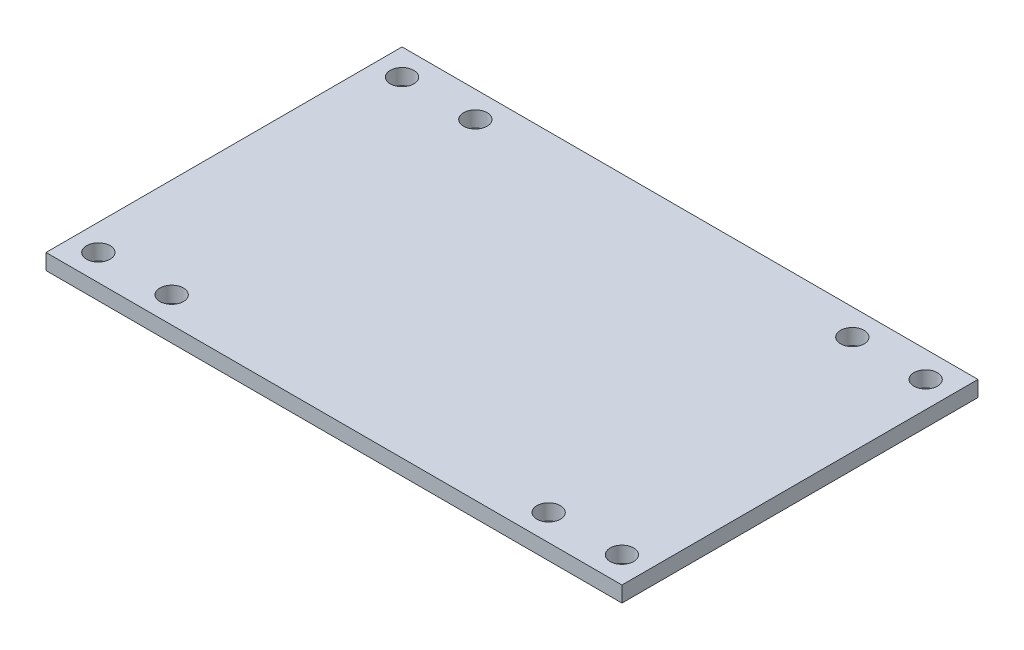
ISO-10303-21;
HEADER;
FILE_DESCRIPTION(('STEP AP214'),'2;1');
FILE_NAME('part.step','',(''),(''),'','','');
FILE_SCHEMA(('AUTOMOTIVE_DESIGN { 1 0 10303 214 1 1 1 1 }'));
ENDSEC;
DATA;
#1=APPLICATION_CONTEXT('core data for automotive mechanical design processes');
#2=APPLICATION_PROTOCOL_DEFINITION('international standard','automotive_design',2000,#1);
#3=PRODUCT_CONTEXT('',#1,'mechanical');
#4=PRODUCT('Part','Part','',(#3));
#5=PRODUCT_RELATED_PRODUCT_CATEGORY('part','',(#4));
#6=PRODUCT_DEFINITION_FORMATION('','',#4);
#7=PRODUCT_DEFINITION_CONTEXT('part definition',#1,'design');
#8=PRODUCT_DEFINITION('design','',#6,#7);
#9=PRODUCT_DEFINITION_SHAPE('','',#8);
#10=(LENGTH_UNIT() NAMED_UNIT(*) SI_UNIT(.MILLI.,.METRE.));
#11=(NAMED_UNIT(*) PLANE_ANGLE_UNIT() SI_UNIT($,.RADIAN.));
#12=(NAMED_UNIT(*) SI_UNIT($,.STERADIAN.) SOLID_ANGLE_UNIT());
#13=UNCERTAINTY_MEASURE_WITH_UNIT(LENGTH_MEASURE(1.E-05),#10,'distance_accuracy_value','');
#14=(GEOMETRIC_REPRESENTATION_CONTEXT(3) GLOBAL_UNCERTAINTY_ASSIGNED_CONTEXT((#13)) GLOBAL_UNIT_ASSIGNED_CONTEXT((#10,
#11,#12)) REPRESENTATION_CONTEXT('',''));
#15=CARTESIAN_POINT('',(0.,0.,0.));
#16=DIRECTION('',(0.,0.,1.));
#17=DIRECTION('',(1.,0.,0.));
#18=AXIS2_PLACEMENT_3D('',#15,#16,#17);
#19=CARTESIAN_POINT('',(-27.5,1.5,0.));
#20=DIRECTION('',(-1.,0.,0.));
#21=DIRECTION('',(0.,0.,1.));
#22=AXIS2_PLACEMENT_3D('',#19,#20,#21);
#23=PLANE('',#22);
#24=DIRECTION('',(0.,0.,-1.));
#25=VECTOR('',#24,1.);
#26=CARTESIAN_POINT('',(-27.5,0.,0.));
#27=LINE('',#26,#25);
#28=CARTESIAN_POINT('',(-27.5,0.,17.));
#29=VERTEX_POINT('',#28);
#30=CARTESIAN_POINT('',(-27.5,0.,-17.));
#31=VERTEX_POINT('',#30);
#32=EDGE_CURVE('E118',#29,#31,#27,.T.);
#33=ORIENTED_EDGE('',*,*,#32,.F.);
#34=DIRECTION('',(0.,-1.,0.));
#35=VECTOR('',#34,1.);
#36=CARTESIAN_POINT('',(-27.5,1.5,17.));
#37=LINE('',#36,#35);
#38=CARTESIAN_POINT('',(-27.5,1.5,17.));
#39=VERTEX_POINT('',#38);
#40=EDGE_CURVE('E11',#39,#29,#37,.T.);
#41=ORIENTED_EDGE('',*,*,#40,.F.);
#42=DIRECTION('',(0.,0.,-1.));
#43=VECTOR('',#42,1.);
#44=CARTESIAN_POINT('',(-27.5,1.5,0.));
#45=LINE('',#44,#43);
#46=CARTESIAN_POINT('',(-27.5,1.5,-17.));
#47=VERTEX_POINT('',#46);
#48=EDGE_CURVE('E107',#39,#47,#45,.T.);
#49=ORIENTED_EDGE('',*,*,#48,.T.);
#50=DIRECTION('',(0.,-1.,0.));
#51=VECTOR('',#50,1.);
#52=CARTESIAN_POINT('',(-27.5,1.5,-17.));
#53=LINE('',#52,#51);
#54=EDGE_CURVE('E86',#47,#31,#53,.T.);
#55=ORIENTED_EDGE('',*,*,#54,.T.);
#56=EDGE_LOOP('',(#33,#41,#49,#55));
#57=FACE_BOUND('',#56,.T.);
#58=ADVANCED_FACE('F47',(#57),#23,.T.);
#59=CARTESIAN_POINT('',(0.,1.5,17.));
#60=DIRECTION('',(0.,0.,1.));
#61=DIRECTION('',(1.,0.,0.));
#62=AXIS2_PLACEMENT_3D('',#59,#60,#61);
#63=PLANE('',#62);
#64=DIRECTION('',(-1.,0.,0.));
#65=VECTOR('',#64,1.);
#66=CARTESIAN_POINT('',(0.,0.,17.));
#67=LINE('',#66,#65);
#68=CARTESIAN_POINT('',(27.5,0.,17.));
#69=VERTEX_POINT('',#68);
#70=EDGE_CURVE('E99',#69,#29,#67,.T.);
#71=ORIENTED_EDGE('',*,*,#70,.F.);
#72=DIRECTION('',(0.,-1.,0.));
#73=VECTOR('',#72,1.);
#74=CARTESIAN_POINT('',(27.5,1.5,17.));
#75=LINE('',#74,#73);
#76=CARTESIAN_POINT('',(27.5,1.5,17.));
#77=VERTEX_POINT('',#76);
#78=EDGE_CURVE('E56',#77,#69,#75,.T.);
#79=ORIENTED_EDGE('',*,*,#78,.F.);
#80=DIRECTION('',(-1.,0.,0.));
#81=VECTOR('',#80,1.);
#82=CARTESIAN_POINT('',(0.,1.5,17.));
#83=LINE('',#82,#81);
#84=EDGE_CURVE('E97',#77,#39,#83,.T.);
#85=ORIENTED_EDGE('',*,*,#84,.T.);
#86=ORIENTED_EDGE('',*,*,#40,.T.);
#87=EDGE_LOOP('',(#71,#79,#85,#86));
#88=FACE_BOUND('',#87,.T.);
#89=ADVANCED_FACE('F95',(#88),#63,.T.);
#90=CARTESIAN_POINT('',(27.5,1.5,0.));
#91=DIRECTION('',(-1.,0.,0.));
#92=DIRECTION('',(0.,0.,1.));
#93=AXIS2_PLACEMENT_3D('',#90,#91,#92);
#94=PLANE('',#93);
#95=DIRECTION('',(0.,0.,-1.));
#96=VECTOR('',#95,1.);
#97=CARTESIAN_POINT('',(27.5,0.,0.));
#98=LINE('',#97,#96);
#99=CARTESIAN_POINT('',(27.5,0.,-17.));
#100=VERTEX_POINT('',#99);
#101=EDGE_CURVE('E79',#69,#100,#98,.T.);
#102=ORIENTED_EDGE('',*,*,#101,.T.);
#103=DIRECTION('',(0.,-1.,0.));
#104=VECTOR('',#103,1.);
#105=CARTESIAN_POINT('',(27.5,1.5,-17.));
#106=LINE('',#105,#104);
#107=CARTESIAN_POINT('',(27.5,1.5,-17.));
#108=VERTEX_POINT('',#107);
#109=EDGE_CURVE('E101',#108,#100,#106,.T.);
#110=ORIENTED_EDGE('',*,*,#109,.F.);
#111=DIRECTION('',(0.,0.,-1.));
#112=VECTOR('',#111,1.);
#113=CARTESIAN_POINT('',(27.5,1.5,0.));
#114=LINE('',#113,#112);
#115=EDGE_CURVE('E102',#77,#108,#114,.T.);
#116=ORIENTED_EDGE('',*,*,#115,.F.);
#117=ORIENTED_EDGE('',*,*,#78,.T.);
#118=EDGE_LOOP('',(#102,#110,#116,#117));
#119=FACE_BOUND('',#118,.T.);
#120=ADVANCED_FACE('F103',(#119),#94,.F.);
#121=CARTESIAN_POINT('',(0.,1.5,-17.));
#122=DIRECTION('',(0.,0.,1.));
#123=DIRECTION('',(1.,0.,0.));
#124=AXIS2_PLACEMENT_3D('',#121,#122,#123);
#125=PLANE('',#124);
#126=DIRECTION('',(-1.,0.,0.));
#127=VECTOR('',#126,1.);
#128=CARTESIAN_POINT('',(0.,0.,-17.));
#129=LINE('',#128,#127);
#130=EDGE_CURVE('E112',#100,#31,#129,.T.);
#131=ORIENTED_EDGE('',*,*,#130,.T.);
#132=ORIENTED_EDGE('',*,*,#54,.F.);
#133=DIRECTION('',(-1.,0.,0.));
#134=VECTOR('',#133,1.);
#135=CARTESIAN_POINT('',(0.,1.5,-17.));
#136=LINE('',#135,#134);
#137=EDGE_CURVE('E64',#108,#47,#136,.T.);
#138=ORIENTED_EDGE('',*,*,#137,.F.);
#139=ORIENTED_EDGE('',*,*,#109,.T.);
#140=EDGE_LOOP('',(#131,#132,#138,#139));
#141=FACE_BOUND('',#140,.T.);
#142=ADVANCED_FACE('F135',(#141),#125,.F.);
#143=CARTESIAN_POINT('',(0.,1.5,0.));
#144=DIRECTION('',(0.,1.,0.));
#145=DIRECTION('',(0.,0.,1.));
#146=AXIS2_PLACEMENT_3D('',#143,#144,#145);
#147=PLANE('',#146);
#148=CARTESIAN_POINT('',(-18.,1.5,14.5));
#149=DIRECTION('',(0.,1.,0.));
#150=DIRECTION('',(0.,0.,1.));
#151=AXIS2_PLACEMENT_3D('',#148,#149,#150);
#152=CIRCLE('',#151,1.125);
#153=CARTESIAN_POINT('',(-18.,1.5,15.625));
#154=VERTEX_POINT('',#153);
#155=EDGE_CURVE('E228',#154,#154,#152,.T.);
#156=ORIENTED_EDGE('',*,*,#155,.F.);
#157=EDGE_LOOP('',(#156));
#158=FACE_BOUND('',#157,.T.);
#159=CARTESIAN_POINT('',(18.,1.5,-14.5));
#160=DIRECTION('',(0.,1.,0.));
#161=DIRECTION('',(0.,0.,1.));
#162=AXIS2_PLACEMENT_3D('',#159,#160,#161);
#163=CIRCLE('',#162,1.125);
#164=CARTESIAN_POINT('',(18.,1.5,-13.375));
#165=VERTEX_POINT('',#164);
#166=EDGE_CURVE('E219',#165,#165,#163,.T.);
#167=ORIENTED_EDGE('',*,*,#166,.F.);
#168=EDGE_LOOP('',(#167));
#169=FACE_BOUND('',#168,.T.);
#170=CARTESIAN_POINT('',(-18.,1.5,-14.5));
#171=DIRECTION('',(0.,1.,0.));
#172=DIRECTION('',(0.,0.,1.));
#173=AXIS2_PLACEMENT_3D('',#170,#171,#172);
#174=CIRCLE('',#173,1.125);
#175=CARTESIAN_POINT('',(-18.,1.5,-13.375));
#176=VERTEX_POINT('',#175);
#177=EDGE_CURVE('E244',#176,#176,#174,.T.);
#178=ORIENTED_EDGE('',*,*,#177,.F.);
#179=EDGE_LOOP('',(#178));
#180=FACE_BOUND('',#179,.T.);
#181=CARTESIAN_POINT('',(25.,1.5,-14.5));
#182=DIRECTION('',(0.,1.,0.));
#183=DIRECTION('',(0.,0.,1.));
#184=AXIS2_PLACEMENT_3D('',#181,#182,#183);
#185=CIRCLE('',#184,1.125);
#186=CARTESIAN_POINT('',(25.,1.5,-13.375));
#187=VERTEX_POINT('',#186);
#188=EDGE_CURVE('E235',#187,#187,#185,.T.);
#189=ORIENTED_EDGE('',*,*,#188,.F.);
#190=EDGE_LOOP('',(#189));
#191=FACE_BOUND('',#190,.T.);
#192=CARTESIAN_POINT('',(18.,1.5,14.5));
#193=DIRECTION('',(0.,1.,0.));
#194=DIRECTION('',(0.,0.,1.));
#195=AXIS2_PLACEMENT_3D('',#192,#193,#194);
#196=CIRCLE('',#195,1.125);
#197=CARTESIAN_POINT('',(18.,1.5,15.625));
#198=VERTEX_POINT('',#197);
#199=EDGE_CURVE('E191',#198,#198,#196,.T.);
#200=ORIENTED_EDGE('',*,*,#199,.F.);
#201=EDGE_LOOP('',(#200));
#202=FACE_BOUND('',#201,.T.);
#203=CARTESIAN_POINT('',(25.,1.5,14.5));
#204=DIRECTION('',(0.,1.,0.));
#205=DIRECTION('',(0.,0.,1.));
#206=AXIS2_PLACEMENT_3D('',#203,#204,#205);
#207=CIRCLE('',#206,1.125);
#208=CARTESIAN_POINT('',(25.,1.5,15.625));
#209=VERTEX_POINT('',#208);
#210=EDGE_CURVE('E197',#209,#209,#207,.T.);
#211=ORIENTED_EDGE('',*,*,#210,.F.);
#212=EDGE_LOOP('',(#211));
#213=FACE_BOUND('',#212,.T.);
#214=CARTESIAN_POINT('',(-25.,1.5,14.5));
#215=DIRECTION('',(0.,1.,0.));
#216=DIRECTION('',(0.,0.,1.));
#217=AXIS2_PLACEMENT_3D('',#214,#215,#216);
#218=CIRCLE('',#217,1.125);
#219=CARTESIAN_POINT('',(-25.,1.5,15.625));
#220=VERTEX_POINT('',#219);
#221=EDGE_CURVE('E211',#220,#220,#218,.T.);
#222=ORIENTED_EDGE('',*,*,#221,.F.);
#223=EDGE_LOOP('',(#222));
#224=FACE_BOUND('',#223,.T.);
#225=CARTESIAN_POINT('',(-25.,1.5,-14.5));
#226=DIRECTION('',(0.,1.,0.));
#227=DIRECTION('',(0.,0.,1.));
#228=AXIS2_PLACEMENT_3D('',#225,#226,#227);
#229=CIRCLE('',#228,1.125);
#230=CARTESIAN_POINT('',(-25.,1.5,-13.375));
#231=VERTEX_POINT('',#230);
#232=EDGE_CURVE('E122',#231,#231,#229,.T.);
#233=ORIENTED_EDGE('',*,*,#232,.F.);
#234=EDGE_LOOP('',(#233));
#235=FACE_BOUND('',#234,.T.);
#236=ORIENTED_EDGE('',*,*,#48,.F.);
#237=ORIENTED_EDGE('',*,*,#84,.F.);
#238=ORIENTED_EDGE('',*,*,#115,.T.);
#239=ORIENTED_EDGE('',*,*,#137,.T.);
#240=EDGE_LOOP('',(#236,#237,#238,#239));
#241=FACE_BOUND('',#240,.T.);
#242=ADVANCED_FACE('F106',(#158,#169,#180,#191,#202,#213,#224,#235,#241),#147,.T.);
#243=CARTESIAN_POINT('',(0.,0.,0.));
#244=DIRECTION('',(0.,1.,0.));
#245=DIRECTION('',(0.,0.,1.));
#246=AXIS2_PLACEMENT_3D('',#243,#244,#245);
#247=PLANE('',#246);
#248=CARTESIAN_POINT('',(-18.,0.,14.5));
#249=DIRECTION('',(0.,1.,0.));
#250=DIRECTION('',(0.,0.,1.));
#251=AXIS2_PLACEMENT_3D('',#248,#249,#250);
#252=CIRCLE('',#251,1.125);
#253=CARTESIAN_POINT('',(-18.,0.,15.625));
#254=VERTEX_POINT('',#253);
#255=EDGE_CURVE('E202',#254,#254,#252,.T.);
#256=ORIENTED_EDGE('',*,*,#255,.T.);
#257=EDGE_LOOP('',(#256));
#258=FACE_BOUND('',#257,.T.);
#259=CARTESIAN_POINT('',(18.,0.,-14.5));
#260=DIRECTION('',(0.,1.,0.));
#261=DIRECTION('',(0.,0.,1.));
#262=AXIS2_PLACEMENT_3D('',#259,#260,#261);
#263=CIRCLE('',#262,1.125);
#264=CARTESIAN_POINT('',(18.,0.,-13.375));
#265=VERTEX_POINT('',#264);
#266=EDGE_CURVE('E224',#265,#265,#263,.T.);
#267=ORIENTED_EDGE('',*,*,#266,.T.);
#268=EDGE_LOOP('',(#267));
#269=FACE_BOUND('',#268,.T.);
#270=CARTESIAN_POINT('',(-18.,0.,-14.5));
#271=DIRECTION('',(0.,1.,0.));
#272=DIRECTION('',(0.,0.,1.));
#273=AXIS2_PLACEMENT_3D('',#270,#271,#272);
#274=CIRCLE('',#273,1.125);
#275=CARTESIAN_POINT('',(-18.,0.,-13.375));
#276=VERTEX_POINT('',#275);
#277=EDGE_CURVE('E223',#276,#276,#274,.T.);
#278=ORIENTED_EDGE('',*,*,#277,.T.);
#279=EDGE_LOOP('',(#278));
#280=FACE_BOUND('',#279,.T.);
#281=CARTESIAN_POINT('',(25.,0.,-14.5));
#282=DIRECTION('',(0.,1.,0.));
#283=DIRECTION('',(0.,0.,1.));
#284=AXIS2_PLACEMENT_3D('',#281,#282,#283);
#285=CIRCLE('',#284,1.125);
#286=CARTESIAN_POINT('',(25.,0.,-13.375));
#287=VERTEX_POINT('',#286);
#288=EDGE_CURVE('E240',#287,#287,#285,.T.);
#289=ORIENTED_EDGE('',*,*,#288,.T.);
#290=EDGE_LOOP('',(#289));
#291=FACE_BOUND('',#290,.T.);
#292=CARTESIAN_POINT('',(18.,0.,14.5));
#293=DIRECTION('',(0.,1.,0.));
#294=DIRECTION('',(0.,0.,1.));
#295=AXIS2_PLACEMENT_3D('',#292,#293,#294);
#296=CIRCLE('',#295,1.125);
#297=CARTESIAN_POINT('',(18.,0.,15.625));
#298=VERTEX_POINT('',#297);
#299=EDGE_CURVE('E194',#298,#298,#296,.T.);
#300=ORIENTED_EDGE('',*,*,#299,.T.);
#301=EDGE_LOOP('',(#300));
#302=FACE_BOUND('',#301,.T.);
#303=CARTESIAN_POINT('',(25.,0.,14.5));
#304=DIRECTION('',(0.,1.,0.));
#305=DIRECTION('',(0.,0.,1.));
#306=AXIS2_PLACEMENT_3D('',#303,#304,#305);
#307=CIRCLE('',#306,1.125);
#308=CARTESIAN_POINT('',(25.,0.,15.625));
#309=VERTEX_POINT('',#308);
#310=EDGE_CURVE('E205',#309,#309,#307,.T.);
#311=ORIENTED_EDGE('',*,*,#310,.T.);
#312=EDGE_LOOP('',(#311));
#313=FACE_BOUND('',#312,.T.);
#314=CARTESIAN_POINT('',(-25.,0.,14.5));
#315=DIRECTION('',(0.,1.,0.));
#316=DIRECTION('',(0.,0.,1.));
#317=AXIS2_PLACEMENT_3D('',#314,#315,#316);
#318=CIRCLE('',#317,1.125);
#319=CARTESIAN_POINT('',(-25.,0.,15.625));
#320=VERTEX_POINT('',#319);
#321=EDGE_CURVE('E215',#320,#320,#318,.T.);
#322=ORIENTED_EDGE('',*,*,#321,.T.);
#323=EDGE_LOOP('',(#322));
#324=FACE_BOUND('',#323,.T.);
#325=CARTESIAN_POINT('',(-25.,0.,-14.5));
#326=DIRECTION('',(0.,1.,0.));
#327=DIRECTION('',(0.,0.,1.));
#328=AXIS2_PLACEMENT_3D('',#325,#326,#327);
#329=CIRCLE('',#328,1.125);
#330=CARTESIAN_POINT('',(-25.,0.,-13.375));
#331=VERTEX_POINT('',#330);
#332=EDGE_CURVE('E239',#331,#331,#329,.T.);
#333=ORIENTED_EDGE('',*,*,#332,.T.);
#334=EDGE_LOOP('',(#333));
#335=FACE_BOUND('',#334,.T.);
#336=ORIENTED_EDGE('',*,*,#32,.T.);
#337=ORIENTED_EDGE('',*,*,#130,.F.);
#338=ORIENTED_EDGE('',*,*,#101,.F.);
#339=ORIENTED_EDGE('',*,*,#70,.T.);
#340=EDGE_LOOP('',(#336,#337,#338,#339));
#341=FACE_BOUND('',#340,.T.);
#342=ADVANCED_FACE('F137',(#258,#269,#280,#291,#302,#313,#324,#335,#341),#247,.F.);
#343=CARTESIAN_POINT('',(-25.,1.5,-14.5));
#344=DIRECTION('',(0.,-1.,0.));
#345=DIRECTION('',(0.,0.,-1.));
#346=AXIS2_PLACEMENT_3D('',#343,#344,#345);
#347=CYLINDRICAL_SURFACE('',#346,1.125);
#348=ORIENTED_EDGE('',*,*,#232,.T.);
#349=EDGE_LOOP('',(#348));
#350=FACE_BOUND('',#349,.T.);
#351=ORIENTED_EDGE('',*,*,#332,.F.);
#352=EDGE_LOOP('',(#351));
#353=FACE_BOUND('',#352,.T.);
#354=ADVANCED_FACE('F151',(#350,#353),#347,.F.);
#355=CARTESIAN_POINT('',(-25.,1.5,14.5));
#356=DIRECTION('',(0.,-1.,0.));
#357=DIRECTION('',(0.,0.,-1.));
#358=AXIS2_PLACEMENT_3D('',#355,#356,#357);
#359=CYLINDRICAL_SURFACE('',#358,1.125);
#360=ORIENTED_EDGE('',*,*,#221,.T.);
#361=EDGE_LOOP('',(#360));
#362=FACE_BOUND('',#361,.T.);
#363=ORIENTED_EDGE('',*,*,#321,.F.);
#364=EDGE_LOOP('',(#363));
#365=FACE_BOUND('',#364,.T.);
#366=ADVANCED_FACE('F158',(#362,#365),#359,.F.);
#367=CARTESIAN_POINT('',(25.,1.5,14.5));
#368=DIRECTION('',(0.,-1.,0.));
#369=DIRECTION('',(0.,0.,-1.));
#370=AXIS2_PLACEMENT_3D('',#367,#368,#369);
#371=CYLINDRICAL_SURFACE('',#370,1.125);
#372=ORIENTED_EDGE('',*,*,#210,.T.);
#373=EDGE_LOOP('',(#372));
#374=FACE_BOUND('',#373,.T.);
#375=ORIENTED_EDGE('',*,*,#310,.F.);
#376=EDGE_LOOP('',(#375));
#377=FACE_BOUND('',#376,.T.);
#378=ADVANCED_FACE('F179',(#374,#377),#371,.F.);
#379=CARTESIAN_POINT('',(18.,1.5,14.5));
#380=DIRECTION('',(0.,-1.,0.));
#381=DIRECTION('',(0.,0.,-1.));
#382=AXIS2_PLACEMENT_3D('',#379,#380,#381);
#383=CYLINDRICAL_SURFACE('',#382,1.125);
#384=ORIENTED_EDGE('',*,*,#199,.T.);
#385=EDGE_LOOP('',(#384));
#386=FACE_BOUND('',#385,.T.);
#387=ORIENTED_EDGE('',*,*,#299,.F.);
#388=EDGE_LOOP('',(#387));
#389=FACE_BOUND('',#388,.T.);
#390=ADVANCED_FACE('F168',(#386,#389),#383,.F.);
#391=CARTESIAN_POINT('',(25.,1.5,-14.5));
#392=DIRECTION('',(0.,-1.,0.));
#393=DIRECTION('',(0.,0.,-1.));
#394=AXIS2_PLACEMENT_3D('',#391,#392,#393);
#395=CYLINDRICAL_SURFACE('',#394,1.125);
#396=ORIENTED_EDGE('',*,*,#188,.T.);
#397=EDGE_LOOP('',(#396));
#398=FACE_BOUND('',#397,.T.);
#399=ORIENTED_EDGE('',*,*,#288,.F.);
#400=EDGE_LOOP('',(#399));
#401=FACE_BOUND('',#400,.T.);
#402=ADVANCED_FACE('F164',(#398,#401),#395,.F.);
#403=CARTESIAN_POINT('',(-18.,1.5,-14.5));
#404=DIRECTION('',(0.,-1.,0.));
#405=DIRECTION('',(0.,0.,-1.));
#406=AXIS2_PLACEMENT_3D('',#403,#404,#405);
#407=CYLINDRICAL_SURFACE('',#406,1.125);
#408=ORIENTED_EDGE('',*,*,#177,.T.);
#409=EDGE_LOOP('',(#408));
#410=FACE_BOUND('',#409,.T.);
#411=ORIENTED_EDGE('',*,*,#277,.F.);
#412=EDGE_LOOP('',(#411));
#413=FACE_BOUND('',#412,.T.);
#414=ADVANCED_FACE('F160',(#410,#413),#407,.F.);
#415=CARTESIAN_POINT('',(18.,1.5,-14.5));
#416=DIRECTION('',(0.,-1.,0.));
#417=DIRECTION('',(0.,0.,-1.));
#418=AXIS2_PLACEMENT_3D('',#415,#416,#417);
#419=CYLINDRICAL_SURFACE('',#418,1.125);
#420=ORIENTED_EDGE('',*,*,#166,.T.);
#421=EDGE_LOOP('',(#420));
#422=FACE_BOUND('',#421,.T.);
#423=ORIENTED_EDGE('',*,*,#266,.F.);
#424=EDGE_LOOP('',(#423));
#425=FACE_BOUND('',#424,.T.);
#426=ADVANCED_FACE('F163',(#422,#425),#419,.F.);
#427=CARTESIAN_POINT('',(-18.,1.5,14.5));
#428=DIRECTION('',(0.,-1.,0.));
#429=DIRECTION('',(0.,0.,-1.));
#430=AXIS2_PLACEMENT_3D('',#427,#428,#429);
#431=CYLINDRICAL_SURFACE('',#430,1.125);
#432=ORIENTED_EDGE('',*,*,#155,.T.);
#433=EDGE_LOOP('',(#432));
#434=FACE_BOUND('',#433,.T.);
#435=ORIENTED_EDGE('',*,*,#255,.F.);
#436=EDGE_LOOP('',(#435));
#437=FACE_BOUND('',#436,.T.);
#438=ADVANCED_FACE('F170',(#434,#437),#431,.F.);
#439=CLOSED_SHELL('',(#58,#89,#120,#142,#242,#342,#354,#366,#378,#390,#402,#414,#426,#438));
#440=MANIFOLD_SOLID_BREP('B2',#439);
#441=ADVANCED_BREP_SHAPE_REPRESENTATION('',(#18,#440),#14);
#442=SHAPE_DEFINITION_REPRESENTATION(#9,#441);
ENDSEC;
END-ISO-10303-21;
